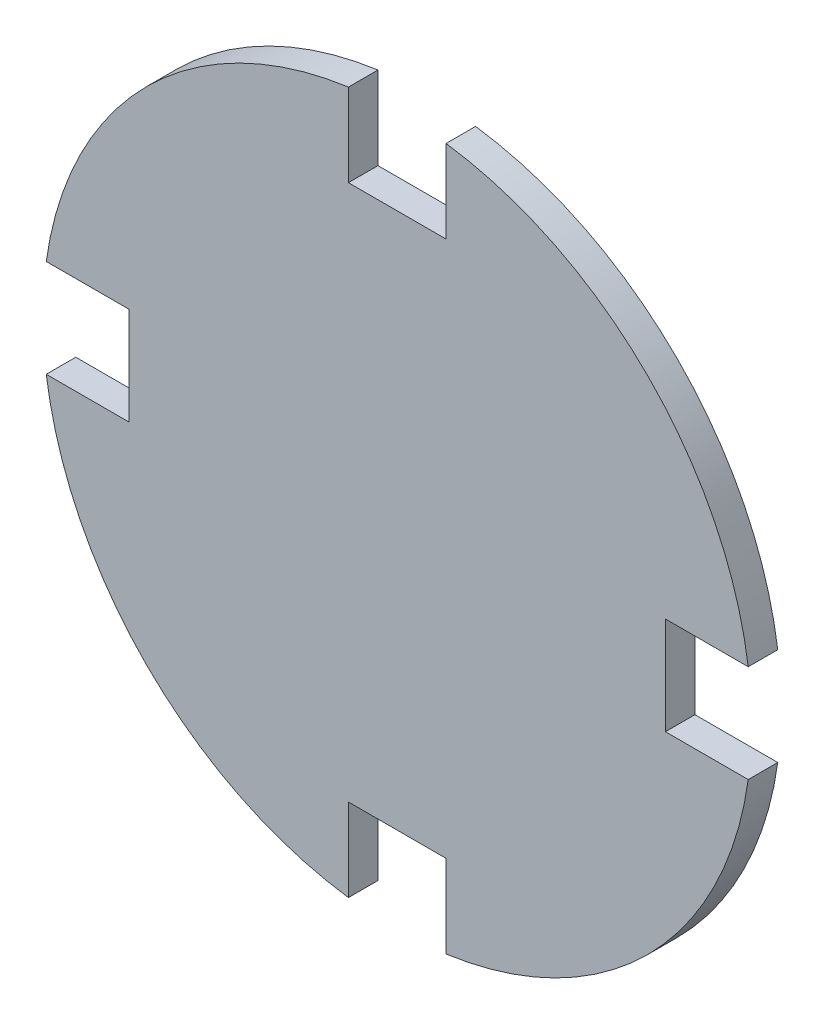
ISO-10303-21;
HEADER;
FILE_DESCRIPTION(('STEP AP214'),'2;1');
FILE_NAME('part.step','',(''),(''),'','','');
FILE_SCHEMA(('AUTOMOTIVE_DESIGN { 1 0 10303 214 1 1 1 1 }'));
ENDSEC;
DATA;
#1=APPLICATION_CONTEXT('core data for automotive mechanical design processes');
#2=APPLICATION_PROTOCOL_DEFINITION('international standard','automotive_design',2000,#1);
#3=PRODUCT_CONTEXT('',#1,'mechanical');
#4=PRODUCT('Part','Part','',(#3));
#5=PRODUCT_RELATED_PRODUCT_CATEGORY('part','',(#4));
#6=PRODUCT_DEFINITION_FORMATION('','',#4);
#7=PRODUCT_DEFINITION_CONTEXT('part definition',#1,'design');
#8=PRODUCT_DEFINITION('design','',#6,#7);
#9=PRODUCT_DEFINITION_SHAPE('','',#8);
#10=(LENGTH_UNIT() NAMED_UNIT(*) SI_UNIT(.MILLI.,.METRE.));
#11=(NAMED_UNIT(*) PLANE_ANGLE_UNIT() SI_UNIT($,.RADIAN.));
#12=(NAMED_UNIT(*) SI_UNIT($,.STERADIAN.) SOLID_ANGLE_UNIT());
#13=UNCERTAINTY_MEASURE_WITH_UNIT(LENGTH_MEASURE(1.E-05),#10,'distance_accuracy_value','');
#14=(GEOMETRIC_REPRESENTATION_CONTEXT(3) GLOBAL_UNCERTAINTY_ASSIGNED_CONTEXT((#13)) GLOBAL_UNIT_ASSIGNED_CONTEXT((#10,
#11,#12)) REPRESENTATION_CONTEXT('',''));
#15=CARTESIAN_POINT('',(0.,0.,0.));
#16=DIRECTION('',(0.,0.,1.));
#17=DIRECTION('',(1.,0.,0.));
#18=AXIS2_PLACEMENT_3D('',#15,#16,#17);
#19=CARTESIAN_POINT('',(-150.946215586881,-20.9999999999746,6.35));
#20=DIRECTION('',(1.69175186859434E-12,1.,0.));
#21=DIRECTION('',(-1.,1.69175186859434E-12,0.));
#22=AXIS2_PLACEMENT_3D('',#19,#20,#21);
#23=PLANE('',#22);
#24=DIRECTION('',(1.,-1.69175186859434E-12,0.));
#25=VECTOR('',#24,1.);
#26=CARTESIAN_POINT('',(-150.946215586881,-20.9999999999746,-6.35));
#27=LINE('',#26,#25);
#28=CARTESIAN_POINT('',(-150.946215586881,-20.9999999999745,-6.35));
#29=VERTEX_POINT('',#28);
#30=CARTESIAN_POINT('',(-115.332,-21.0000000000348,-6.35));
#31=VERTEX_POINT('',#30);
#32=EDGE_CURVE('E182',#29,#31,#27,.T.);
#33=ORIENTED_EDGE('',*,*,#32,.F.);
#34=DIRECTION('',(0.,0.,-1.));
#35=VECTOR('',#34,1.);
#36=CARTESIAN_POINT('',(-150.946215586881,-20.9999999999745,6.35));
#37=LINE('',#36,#35);
#38=CARTESIAN_POINT('',(-150.946215586881,-20.9999999999745,6.35));
#39=VERTEX_POINT('',#38);
#40=EDGE_CURVE('E11',#39,#29,#37,.T.);
#41=ORIENTED_EDGE('',*,*,#40,.F.);
#42=DIRECTION('',(1.,-1.69175186859434E-12,0.));
#43=VECTOR('',#42,1.);
#44=CARTESIAN_POINT('',(-150.946215586881,-20.9999999999746,6.35));
#45=LINE('',#44,#43);
#46=CARTESIAN_POINT('',(-115.332,-21.0000000000348,6.35));
#47=VERTEX_POINT('',#46);
#48=EDGE_CURVE('E217',#39,#47,#45,.T.);
#49=ORIENTED_EDGE('',*,*,#48,.T.);
#50=DIRECTION('',(0.,0.,-1.));
#51=VECTOR('',#50,1.);
#52=CARTESIAN_POINT('',(-115.332,-21.0000000000348,6.35));
#53=LINE('',#52,#51);
#54=EDGE_CURVE('E39',#47,#31,#53,.T.);
#55=ORIENTED_EDGE('',*,*,#54,.T.);
#56=EDGE_LOOP('',(#33,#41,#49,#55));
#57=FACE_BOUND('',#56,.T.);
#58=ADVANCED_FACE('F36',(#57),#23,.T.);
#59=CARTESIAN_POINT('',(0.,0.,6.35));
#60=DIRECTION('',(0.,0.,-1.));
#61=DIRECTION('',(-1.,0.,0.));
#62=AXIS2_PLACEMENT_3D('',#59,#60,#61);
#63=CYLINDRICAL_SURFACE('',#62,152.4);
#64=CARTESIAN_POINT('',(0.,0.,-6.35));
#65=DIRECTION('',(0.,0.,1.));
#66=DIRECTION('',(1.,0.,0.));
#67=AXIS2_PLACEMENT_3D('',#64,#65,#66);
#68=CIRCLE('',#67,152.4);
#69=CARTESIAN_POINT('',(-21.0000000000006,-150.946215586877,-6.35));
#70=VERTEX_POINT('',#69);
#71=EDGE_CURVE('E105',#29,#70,#68,.T.);
#72=ORIENTED_EDGE('',*,*,#71,.T.);
#73=DIRECTION('',(0.,0.,-1.));
#74=VECTOR('',#73,1.);
#75=CARTESIAN_POINT('',(-21.0000000000006,-150.946215586877,6.35));
#76=LINE('',#75,#74);
#77=CARTESIAN_POINT('',(-21.0000000000006,-150.946215586877,6.35));
#78=VERTEX_POINT('',#77);
#79=EDGE_CURVE('E45',#78,#70,#76,.T.);
#80=ORIENTED_EDGE('',*,*,#79,.F.);
#81=CARTESIAN_POINT('',(0.,0.,6.35));
#82=DIRECTION('',(0.,0.,1.));
#83=DIRECTION('',(1.,0.,0.));
#84=AXIS2_PLACEMENT_3D('',#81,#82,#83);
#85=CIRCLE('',#84,152.4);
#86=EDGE_CURVE('E160',#39,#78,#85,.T.);
#87=ORIENTED_EDGE('',*,*,#86,.F.);
#88=ORIENTED_EDGE('',*,*,#40,.T.);
#89=EDGE_LOOP('',(#72,#80,#87,#88));
#90=FACE_BOUND('',#89,.T.);
#91=ADVANCED_FACE('F334',(#90),#63,.T.);
#92=CARTESIAN_POINT('',(-21.0000000000006,-150.946215586877,6.35));
#93=DIRECTION('',(-1.,0.,0.));
#94=DIRECTION('',(0.,0.,1.));
#95=AXIS2_PLACEMENT_3D('',#92,#93,#94);
#96=PLANE('',#95);
#97=DIRECTION('',(0.,1.,0.));
#98=VECTOR('',#97,1.);
#99=CARTESIAN_POINT('',(-21.0000000000006,-150.946215586877,-6.35));
#100=LINE('',#99,#98);
#101=CARTESIAN_POINT('',(-21.0000000000006,-115.332,-6.35));
#102=VERTEX_POINT('',#101);
#103=EDGE_CURVE('E167',#70,#102,#100,.T.);
#104=ORIENTED_EDGE('',*,*,#103,.T.);
#105=DIRECTION('',(0.,0.,-1.));
#106=VECTOR('',#105,1.);
#107=CARTESIAN_POINT('',(-21.0000000000006,-115.332,6.35));
#108=LINE('',#107,#106);
#109=CARTESIAN_POINT('',(-21.0000000000006,-115.332,6.35));
#110=VERTEX_POINT('',#109);
#111=EDGE_CURVE('E164',#110,#102,#108,.T.);
#112=ORIENTED_EDGE('',*,*,#111,.F.);
#113=DIRECTION('',(0.,1.,0.));
#114=VECTOR('',#113,1.);
#115=CARTESIAN_POINT('',(-21.0000000000006,-150.946215586877,6.35));
#116=LINE('',#115,#114);
#117=EDGE_CURVE('E153',#78,#110,#116,.T.);
#118=ORIENTED_EDGE('',*,*,#117,.F.);
#119=ORIENTED_EDGE('',*,*,#79,.T.);
#120=EDGE_LOOP('',(#104,#112,#118,#119));
#121=FACE_BOUND('',#120,.T.);
#122=ADVANCED_FACE('F165',(#121),#96,.F.);
#123=CARTESIAN_POINT('',(-21.0000000000006,-115.332,6.35));
#124=DIRECTION('',(0.,1.,0.));
#125=DIRECTION('',(0.,0.,1.));
#126=AXIS2_PLACEMENT_3D('',#123,#124,#125);
#127=PLANE('',#126);
#128=DIRECTION('',(1.,0.,0.));
#129=VECTOR('',#128,1.);
#130=CARTESIAN_POINT('',(-21.0000000000006,-115.332,-6.35));
#131=LINE('',#130,#129);
#132=CARTESIAN_POINT('',(20.9999999999994,-115.332,-6.35));
#133=VERTEX_POINT('',#132);
#134=EDGE_CURVE('E214',#102,#133,#131,.T.);
#135=ORIENTED_EDGE('',*,*,#134,.T.);
#136=DIRECTION('',(0.,0.,-1.));
#137=VECTOR('',#136,1.);
#138=CARTESIAN_POINT('',(20.9999999999994,-115.332,6.35));
#139=LINE('',#138,#137);
#140=CARTESIAN_POINT('',(20.9999999999994,-115.332,6.35));
#141=VERTEX_POINT('',#140);
#142=EDGE_CURVE('E171',#141,#133,#139,.T.);
#143=ORIENTED_EDGE('',*,*,#142,.F.);
#144=DIRECTION('',(1.,0.,0.));
#145=VECTOR('',#144,1.);
#146=CARTESIAN_POINT('',(-21.0000000000006,-115.332,6.35));
#147=LINE('',#146,#145);
#148=EDGE_CURVE('E158',#110,#141,#147,.T.);
#149=ORIENTED_EDGE('',*,*,#148,.F.);
#150=ORIENTED_EDGE('',*,*,#111,.T.);
#151=EDGE_LOOP('',(#135,#143,#149,#150));
#152=FACE_BOUND('',#151,.T.);
#153=ADVANCED_FACE('F173',(#152),#127,.F.);
#154=CARTESIAN_POINT('',(20.9999999999994,-150.946215586877,6.35));
#155=DIRECTION('',(-1.,0.,0.));
#156=DIRECTION('',(0.,0.,1.));
#157=AXIS2_PLACEMENT_3D('',#154,#155,#156);
#158=PLANE('',#157);
#159=DIRECTION('',(0.,1.,0.));
#160=VECTOR('',#159,1.);
#161=CARTESIAN_POINT('',(20.9999999999994,-150.946215586877,-6.35));
#162=LINE('',#161,#160);
#163=CARTESIAN_POINT('',(20.9999999999994,-150.946215586877,-6.35));
#164=VERTEX_POINT('',#163);
#165=EDGE_CURVE('E211',#164,#133,#162,.T.);
#166=ORIENTED_EDGE('',*,*,#165,.F.);
#167=DIRECTION('',(0.,0.,-1.));
#168=VECTOR('',#167,1.);
#169=CARTESIAN_POINT('',(20.9999999999994,-150.946215586877,6.35));
#170=LINE('',#169,#168);
#171=CARTESIAN_POINT('',(20.9999999999994,-150.946215586877,6.35));
#172=VERTEX_POINT('',#171);
#173=EDGE_CURVE('E221',#172,#164,#170,.T.);
#174=ORIENTED_EDGE('',*,*,#173,.F.);
#175=DIRECTION('',(0.,1.,0.));
#176=VECTOR('',#175,1.);
#177=CARTESIAN_POINT('',(20.9999999999994,-150.946215586877,6.35));
#178=LINE('',#177,#176);
#179=EDGE_CURVE('E175',#172,#141,#178,.T.);
#180=ORIENTED_EDGE('',*,*,#179,.T.);
#181=ORIENTED_EDGE('',*,*,#142,.T.);
#182=EDGE_LOOP('',(#166,#174,#180,#181));
#183=FACE_BOUND('',#182,.T.);
#184=ADVANCED_FACE('F259',(#183),#158,.T.);
#185=CARTESIAN_POINT('',(0.,0.,6.35));
#186=DIRECTION('',(0.,0.,-1.));
#187=DIRECTION('',(-1.,0.,0.));
#188=AXIS2_PLACEMENT_3D('',#185,#186,#187);
#189=CYLINDRICAL_SURFACE('',#188,152.4);
#190=CARTESIAN_POINT('',(0.,0.,-6.35));
#191=DIRECTION('',(0.,0.,1.));
#192=DIRECTION('',(1.,0.,0.));
#193=AXIS2_PLACEMENT_3D('',#190,#191,#192);
#194=CIRCLE('',#193,152.4);
#195=CARTESIAN_POINT('',(150.946215586881,-20.9999999999746,-6.35));
#196=VERTEX_POINT('',#195);
#197=EDGE_CURVE('E209',#164,#196,#194,.T.);
#198=ORIENTED_EDGE('',*,*,#197,.T.);
#199=DIRECTION('',(0.,0.,-1.));
#200=VECTOR('',#199,1.);
#201=CARTESIAN_POINT('',(150.946215586881,-20.9999999999746,6.35));
#202=LINE('',#201,#200);
#203=CARTESIAN_POINT('',(150.946215586881,-20.9999999999746,6.35));
#204=VERTEX_POINT('',#203);
#205=EDGE_CURVE('E223',#204,#196,#202,.T.);
#206=ORIENTED_EDGE('',*,*,#205,.F.);
#207=CARTESIAN_POINT('',(0.,0.,6.35));
#208=DIRECTION('',(0.,0.,1.));
#209=DIRECTION('',(1.,0.,0.));
#210=AXIS2_PLACEMENT_3D('',#207,#208,#209);
#211=CIRCLE('',#210,152.4);
#212=EDGE_CURVE('E177',#172,#204,#211,.T.);
#213=ORIENTED_EDGE('',*,*,#212,.F.);
#214=ORIENTED_EDGE('',*,*,#173,.T.);
#215=EDGE_LOOP('',(#198,#206,#213,#214));
#216=FACE_BOUND('',#215,.T.);
#217=ADVANCED_FACE('F266',(#216),#189,.T.);
#218=CARTESIAN_POINT('',(150.946215586881,-20.9999999999746,6.35));
#219=DIRECTION('',(0.,-1.,0.));
#220=DIRECTION('',(1.,0.,0.));
#221=AXIS2_PLACEMENT_3D('',#218,#219,#220);
#222=PLANE('',#221);
#223=DIRECTION('',(-1.,0.,0.));
#224=VECTOR('',#223,1.);
#225=CARTESIAN_POINT('',(150.946215586881,-20.9999999999746,-6.35));
#226=LINE('',#225,#224);
#227=CARTESIAN_POINT('',(115.332,-20.9999999999745,-6.35));
#228=VERTEX_POINT('',#227);
#229=EDGE_CURVE('E207',#196,#228,#226,.T.);
#230=ORIENTED_EDGE('',*,*,#229,.T.);
#231=DIRECTION('',(0.,0.,-1.));
#232=VECTOR('',#231,1.);
#233=CARTESIAN_POINT('',(115.332,-20.9999999999745,6.35));
#234=LINE('',#233,#232);
#235=CARTESIAN_POINT('',(115.332,-20.9999999999745,6.35));
#236=VERTEX_POINT('',#235);
#237=EDGE_CURVE('E226',#236,#228,#234,.T.);
#238=ORIENTED_EDGE('',*,*,#237,.F.);
#239=DIRECTION('',(-1.,0.,0.));
#240=VECTOR('',#239,1.);
#241=CARTESIAN_POINT('',(150.946215586881,-20.9999999999746,6.35));
#242=LINE('',#241,#240);
#243=EDGE_CURVE('E263',#204,#236,#242,.T.);
#244=ORIENTED_EDGE('',*,*,#243,.F.);
#245=ORIENTED_EDGE('',*,*,#205,.T.);
#246=EDGE_LOOP('',(#230,#238,#244,#245));
#247=FACE_BOUND('',#246,.T.);
#248=ADVANCED_FACE('F268',(#247),#222,.F.);
#249=CARTESIAN_POINT('',(115.332,-20.9999999999745,6.35));
#250=DIRECTION('',(-1.,0.,0.));
#251=DIRECTION('',(0.,-1.,0.));
#252=AXIS2_PLACEMENT_3D('',#249,#250,#251);
#253=PLANE('',#252);
#254=DIRECTION('',(0.,1.,0.));
#255=VECTOR('',#254,1.);
#256=CARTESIAN_POINT('',(115.332,-20.9999999999745,-6.35));
#257=LINE('',#256,#255);
#258=CARTESIAN_POINT('',(115.332,21.0000000000255,-6.35));
#259=VERTEX_POINT('',#258);
#260=EDGE_CURVE('E205',#228,#259,#257,.T.);
#261=ORIENTED_EDGE('',*,*,#260,.T.);
#262=DIRECTION('',(0.,0.,-1.));
#263=VECTOR('',#262,1.);
#264=CARTESIAN_POINT('',(115.332,21.0000000000255,6.35));
#265=LINE('',#264,#263);
#266=CARTESIAN_POINT('',(115.332,21.0000000000255,6.35));
#267=VERTEX_POINT('',#266);
#268=EDGE_CURVE('E229',#267,#259,#265,.T.);
#269=ORIENTED_EDGE('',*,*,#268,.F.);
#270=DIRECTION('',(0.,1.,0.));
#271=VECTOR('',#270,1.);
#272=CARTESIAN_POINT('',(115.332,-20.9999999999745,6.35));
#273=LINE('',#272,#271);
#274=EDGE_CURVE('E270',#236,#267,#273,.T.);
#275=ORIENTED_EDGE('',*,*,#274,.F.);
#276=ORIENTED_EDGE('',*,*,#237,.T.);
#277=EDGE_LOOP('',(#261,#269,#275,#276));
#278=FACE_BOUND('',#277,.T.);
#279=ADVANCED_FACE('F324',(#278),#253,.F.);
#280=CARTESIAN_POINT('',(115.332,21.0000000000255,6.35));
#281=DIRECTION('',(0.,1.,0.));
#282=DIRECTION('',(0.,0.,1.));
#283=AXIS2_PLACEMENT_3D('',#280,#281,#282);
#284=PLANE('',#283);
#285=DIRECTION('',(1.,0.,0.));
#286=VECTOR('',#285,1.);
#287=CARTESIAN_POINT('',(115.332,21.0000000000255,-6.35));
#288=LINE('',#287,#286);
#289=CARTESIAN_POINT('',(150.946215586874,21.0000000000255,-6.35));
#290=VERTEX_POINT('',#289);
#291=EDGE_CURVE('E203',#259,#290,#288,.T.);
#292=ORIENTED_EDGE('',*,*,#291,.T.);
#293=DIRECTION('',(0.,0.,-1.));
#294=VECTOR('',#293,1.);
#295=CARTESIAN_POINT('',(150.946215586874,21.0000000000255,6.35));
#296=LINE('',#295,#294);
#297=CARTESIAN_POINT('',(150.946215586874,21.0000000000255,6.35));
#298=VERTEX_POINT('',#297);
#299=EDGE_CURVE('E232',#298,#290,#296,.T.);
#300=ORIENTED_EDGE('',*,*,#299,.F.);
#301=DIRECTION('',(1.,0.,0.));
#302=VECTOR('',#301,1.);
#303=CARTESIAN_POINT('',(115.332,21.0000000000255,6.35));
#304=LINE('',#303,#302);
#305=EDGE_CURVE('E272',#267,#298,#304,.T.);
#306=ORIENTED_EDGE('',*,*,#305,.F.);
#307=ORIENTED_EDGE('',*,*,#268,.T.);
#308=EDGE_LOOP('',(#292,#300,#306,#307));
#309=FACE_BOUND('',#308,.T.);
#310=ADVANCED_FACE('F320',(#309),#284,.F.);
#311=CARTESIAN_POINT('',(0.,0.,6.35));
#312=DIRECTION('',(0.,0.,-1.));
#313=DIRECTION('',(-1.,0.,0.));
#314=AXIS2_PLACEMENT_3D('',#311,#312,#313);
#315=CYLINDRICAL_SURFACE('',#314,152.4);
#316=CARTESIAN_POINT('',(0.,0.,-6.35));
#317=DIRECTION('',(0.,0.,1.));
#318=DIRECTION('',(1.,0.,0.));
#319=AXIS2_PLACEMENT_3D('',#316,#317,#318);
#320=CIRCLE('',#319,152.4);
#321=CARTESIAN_POINT('',(20.9999999999994,150.946215586877,-6.35));
#322=VERTEX_POINT('',#321);
#323=EDGE_CURVE('E201',#290,#322,#320,.T.);
#324=ORIENTED_EDGE('',*,*,#323,.T.);
#325=DIRECTION('',(0.,0.,-1.));
#326=VECTOR('',#325,1.);
#327=CARTESIAN_POINT('',(20.9999999999994,150.946215586877,6.35));
#328=LINE('',#327,#326);
#329=CARTESIAN_POINT('',(20.9999999999994,150.946215586877,6.35));
#330=VERTEX_POINT('',#329);
#331=EDGE_CURVE('E235',#330,#322,#328,.T.);
#332=ORIENTED_EDGE('',*,*,#331,.F.);
#333=CARTESIAN_POINT('',(0.,0.,6.35));
#334=DIRECTION('',(0.,0.,1.));
#335=DIRECTION('',(1.,0.,0.));
#336=AXIS2_PLACEMENT_3D('',#333,#334,#335);
#337=CIRCLE('',#336,152.4);
#338=EDGE_CURVE('E276',#298,#330,#337,.T.);
#339=ORIENTED_EDGE('',*,*,#338,.F.);
#340=ORIENTED_EDGE('',*,*,#299,.T.);
#341=EDGE_LOOP('',(#324,#332,#339,#340));
#342=FACE_BOUND('',#341,.T.);
#343=ADVANCED_FACE('F316',(#342),#315,.T.);
#344=CARTESIAN_POINT('',(20.9999999999994,150.946215586877,6.35));
#345=DIRECTION('',(1.,0.,0.));
#346=DIRECTION('',(0.,1.,0.));
#347=AXIS2_PLACEMENT_3D('',#344,#345,#346);
#348=PLANE('',#347);
#349=DIRECTION('',(0.,-1.,0.));
#350=VECTOR('',#349,1.);
#351=CARTESIAN_POINT('',(20.9999999999994,150.946215586877,-6.35));
#352=LINE('',#351,#350);
#353=CARTESIAN_POINT('',(20.9999999999994,115.332,-6.35));
#354=VERTEX_POINT('',#353);
#355=EDGE_CURVE('E198',#322,#354,#352,.T.);
#356=ORIENTED_EDGE('',*,*,#355,.T.);
#357=DIRECTION('',(0.,0.,-1.));
#358=VECTOR('',#357,1.);
#359=CARTESIAN_POINT('',(20.9999999999994,115.332,6.35));
#360=LINE('',#359,#358);
#361=CARTESIAN_POINT('',(20.9999999999994,115.332,6.35));
#362=VERTEX_POINT('',#361);
#363=EDGE_CURVE('E238',#362,#354,#360,.T.);
#364=ORIENTED_EDGE('',*,*,#363,.F.);
#365=DIRECTION('',(0.,-1.,0.));
#366=VECTOR('',#365,1.);
#367=CARTESIAN_POINT('',(20.9999999999994,150.946215586877,6.35));
#368=LINE('',#367,#366);
#369=EDGE_CURVE('E278',#330,#362,#368,.T.);
#370=ORIENTED_EDGE('',*,*,#369,.F.);
#371=ORIENTED_EDGE('',*,*,#331,.T.);
#372=EDGE_LOOP('',(#356,#364,#370,#371));
#373=FACE_BOUND('',#372,.T.);
#374=ADVANCED_FACE('F311',(#373),#348,.F.);
#375=CARTESIAN_POINT('',(-21.0000000000006,115.332,6.35));
#376=DIRECTION('',(0.,1.,0.));
#377=DIRECTION('',(0.,0.,1.));
#378=AXIS2_PLACEMENT_3D('',#375,#376,#377);
#379=PLANE('',#378);
#380=DIRECTION('',(1.,0.,0.));
#381=VECTOR('',#380,1.);
#382=CARTESIAN_POINT('',(-21.0000000000006,115.332,-6.35));
#383=LINE('',#382,#381);
#384=CARTESIAN_POINT('',(-21.0000000000006,115.332,-6.35));
#385=VERTEX_POINT('',#384);
#386=EDGE_CURVE('E195',#385,#354,#383,.T.);
#387=ORIENTED_EDGE('',*,*,#386,.F.);
#388=DIRECTION('',(0.,0.,-1.));
#389=VECTOR('',#388,1.);
#390=CARTESIAN_POINT('',(-21.0000000000006,115.332,6.35));
#391=LINE('',#390,#389);
#392=CARTESIAN_POINT('',(-21.0000000000006,115.332,6.35));
#393=VERTEX_POINT('',#392);
#394=EDGE_CURVE('E240',#393,#385,#391,.T.);
#395=ORIENTED_EDGE('',*,*,#394,.F.);
#396=DIRECTION('',(1.,0.,0.));
#397=VECTOR('',#396,1.);
#398=CARTESIAN_POINT('',(-21.0000000000006,115.332,6.35));
#399=LINE('',#398,#397);
#400=EDGE_CURVE('E280',#393,#362,#399,.T.);
#401=ORIENTED_EDGE('',*,*,#400,.T.);
#402=ORIENTED_EDGE('',*,*,#363,.T.);
#403=EDGE_LOOP('',(#387,#395,#401,#402));
#404=FACE_BOUND('',#403,.T.);
#405=ADVANCED_FACE('F305',(#404),#379,.T.);
#406=CARTESIAN_POINT('',(-21.0000000000006,150.946215586877,6.35));
#407=DIRECTION('',(1.,0.,0.));
#408=DIRECTION('',(0.,1.,0.));
#409=AXIS2_PLACEMENT_3D('',#406,#407,#408);
#410=PLANE('',#409);
#411=DIRECTION('',(0.,-1.,0.));
#412=VECTOR('',#411,1.);
#413=CARTESIAN_POINT('',(-21.0000000000006,150.946215586877,-6.35));
#414=LINE('',#413,#412);
#415=CARTESIAN_POINT('',(-21.0000000000006,150.946215586877,-6.35));
#416=VERTEX_POINT('',#415);
#417=EDGE_CURVE('E192',#416,#385,#414,.T.);
#418=ORIENTED_EDGE('',*,*,#417,.F.);
#419=DIRECTION('',(0.,0.,-1.));
#420=VECTOR('',#419,1.);
#421=CARTESIAN_POINT('',(-21.0000000000006,150.946215586877,6.35));
#422=LINE('',#421,#420);
#423=CARTESIAN_POINT('',(-21.0000000000006,150.946215586877,6.35));
#424=VERTEX_POINT('',#423);
#425=EDGE_CURVE('E242',#424,#416,#422,.T.);
#426=ORIENTED_EDGE('',*,*,#425,.F.);
#427=DIRECTION('',(0.,-1.,0.));
#428=VECTOR('',#427,1.);
#429=CARTESIAN_POINT('',(-21.0000000000006,150.946215586877,6.35));
#430=LINE('',#429,#428);
#431=EDGE_CURVE('E283',#424,#393,#430,.T.);
#432=ORIENTED_EDGE('',*,*,#431,.T.);
#433=ORIENTED_EDGE('',*,*,#394,.T.);
#434=EDGE_LOOP('',(#418,#426,#432,#433));
#435=FACE_BOUND('',#434,.T.);
#436=ADVANCED_FACE('F301',(#435),#410,.T.);
#437=CARTESIAN_POINT('',(0.,0.,6.35));
#438=DIRECTION('',(0.,0.,-1.));
#439=DIRECTION('',(-1.,0.,0.));
#440=AXIS2_PLACEMENT_3D('',#437,#438,#439);
#441=CYLINDRICAL_SURFACE('',#440,152.4);
#442=CARTESIAN_POINT('',(0.,0.,-6.35));
#443=DIRECTION('',(0.,0.,1.));
#444=DIRECTION('',(1.,0.,0.));
#445=AXIS2_PLACEMENT_3D('',#442,#443,#444);
#446=CIRCLE('',#445,152.4);
#447=CARTESIAN_POINT('',(-150.946215586877,20.9999999999996,-6.35));
#448=VERTEX_POINT('',#447);
#449=EDGE_CURVE('E190',#416,#448,#446,.T.);
#450=ORIENTED_EDGE('',*,*,#449,.T.);
#451=DIRECTION('',(0.,0.,-1.));
#452=VECTOR('',#451,1.);
#453=CARTESIAN_POINT('',(-150.946215586877,20.9999999999996,6.35));
#454=LINE('',#453,#452);
#455=CARTESIAN_POINT('',(-150.946215586877,20.9999999999996,6.35));
#456=VERTEX_POINT('',#455);
#457=EDGE_CURVE('E244',#456,#448,#454,.T.);
#458=ORIENTED_EDGE('',*,*,#457,.F.);
#459=CARTESIAN_POINT('',(0.,0.,6.35));
#460=DIRECTION('',(0.,0.,1.));
#461=DIRECTION('',(1.,0.,0.));
#462=AXIS2_PLACEMENT_3D('',#459,#460,#461);
#463=CIRCLE('',#462,152.4);
#464=EDGE_CURVE('E286',#424,#456,#463,.T.);
#465=ORIENTED_EDGE('',*,*,#464,.F.);
#466=ORIENTED_EDGE('',*,*,#425,.T.);
#467=EDGE_LOOP('',(#450,#458,#465,#466));
#468=FACE_BOUND('',#467,.T.);
#469=ADVANCED_FACE('F402',(#468),#441,.T.);
#470=CARTESIAN_POINT('',(-150.946215586877,20.9999999999996,6.35));
#471=DIRECTION('',(0.,1.,0.));
#472=DIRECTION('',(0.,0.,1.));
#473=AXIS2_PLACEMENT_3D('',#470,#471,#472);
#474=PLANE('',#473);
#475=DIRECTION('',(1.,0.,0.));
#476=VECTOR('',#475,1.);
#477=CARTESIAN_POINT('',(-150.946215586877,20.9999999999996,-6.35));
#478=LINE('',#477,#476);
#479=CARTESIAN_POINT('',(-115.332,20.9999999999996,-6.35));
#480=VERTEX_POINT('',#479);
#481=EDGE_CURVE('E188',#448,#480,#478,.T.);
#482=ORIENTED_EDGE('',*,*,#481,.T.);
#483=DIRECTION('',(0.,0.,-1.));
#484=VECTOR('',#483,1.);
#485=CARTESIAN_POINT('',(-115.332,20.9999999999996,6.35));
#486=LINE('',#485,#484);
#487=CARTESIAN_POINT('',(-115.332,20.9999999999996,6.35));
#488=VERTEX_POINT('',#487);
#489=EDGE_CURVE('E246',#488,#480,#486,.T.);
#490=ORIENTED_EDGE('',*,*,#489,.F.);
#491=DIRECTION('',(1.,0.,0.));
#492=VECTOR('',#491,1.);
#493=CARTESIAN_POINT('',(-150.946215586877,20.9999999999996,6.35));
#494=LINE('',#493,#492);
#495=EDGE_CURVE('E288',#456,#488,#494,.T.);
#496=ORIENTED_EDGE('',*,*,#495,.F.);
#497=ORIENTED_EDGE('',*,*,#457,.T.);
#498=EDGE_LOOP('',(#482,#490,#496,#497));
#499=FACE_BOUND('',#498,.T.);
#500=ADVANCED_FACE('F296',(#499),#474,.F.);
#501=CARTESIAN_POINT('',(-115.332,20.9999999999996,6.35));
#502=DIRECTION('',(1.,0.,0.));
#503=DIRECTION('',(0.,1.,0.));
#504=AXIS2_PLACEMENT_3D('',#501,#502,#503);
#505=PLANE('',#504);
#506=DIRECTION('',(0.,-1.,0.));
#507=VECTOR('',#506,1.);
#508=CARTESIAN_POINT('',(-115.332,20.9999999999996,-6.35));
#509=LINE('',#508,#507);
#510=EDGE_CURVE('E185',#480,#31,#509,.T.);
#511=ORIENTED_EDGE('',*,*,#510,.T.);
#512=ORIENTED_EDGE('',*,*,#54,.F.);
#513=DIRECTION('',(0.,-1.,0.));
#514=VECTOR('',#513,1.);
#515=CARTESIAN_POINT('',(-115.332,20.9999999999996,6.35));
#516=LINE('',#515,#514);
#517=EDGE_CURVE('E115',#488,#47,#516,.T.);
#518=ORIENTED_EDGE('',*,*,#517,.F.);
#519=ORIENTED_EDGE('',*,*,#489,.T.);
#520=EDGE_LOOP('',(#511,#512,#518,#519));
#521=FACE_BOUND('',#520,.T.);
#522=ADVANCED_FACE('F251',(#521),#505,.F.);
#523=CARTESIAN_POINT('',(0.,0.,6.35));
#524=DIRECTION('',(0.,0.,1.));
#525=DIRECTION('',(1.,0.,0.));
#526=AXIS2_PLACEMENT_3D('',#523,#524,#525);
#527=PLANE('',#526);
#528=ORIENTED_EDGE('',*,*,#48,.F.);
#529=ORIENTED_EDGE('',*,*,#86,.T.);
#530=ORIENTED_EDGE('',*,*,#117,.T.);
#531=ORIENTED_EDGE('',*,*,#148,.T.);
#532=ORIENTED_EDGE('',*,*,#179,.F.);
#533=ORIENTED_EDGE('',*,*,#212,.T.);
#534=ORIENTED_EDGE('',*,*,#243,.T.);
#535=ORIENTED_EDGE('',*,*,#274,.T.);
#536=ORIENTED_EDGE('',*,*,#305,.T.);
#537=ORIENTED_EDGE('',*,*,#338,.T.);
#538=ORIENTED_EDGE('',*,*,#369,.T.);
#539=ORIENTED_EDGE('',*,*,#400,.F.);
#540=ORIENTED_EDGE('',*,*,#431,.F.);
#541=ORIENTED_EDGE('',*,*,#464,.T.);
#542=ORIENTED_EDGE('',*,*,#495,.T.);
#543=ORIENTED_EDGE('',*,*,#517,.T.);
#544=EDGE_LOOP('',(#528,#529,#530,#531,#532,#533,#534,#535,#536,#537,#538,#539,#540,#541,#542,#543));
#545=FACE_BOUND('',#544,.T.);
#546=ADVANCED_FACE('F155',(#545),#527,.T.);
#547=CARTESIAN_POINT('',(0.,0.,-6.35));
#548=DIRECTION('',(0.,0.,1.));
#549=DIRECTION('',(1.,0.,0.));
#550=AXIS2_PLACEMENT_3D('',#547,#548,#549);
#551=PLANE('',#550);
#552=ORIENTED_EDGE('',*,*,#32,.T.);
#553=ORIENTED_EDGE('',*,*,#510,.F.);
#554=ORIENTED_EDGE('',*,*,#481,.F.);
#555=ORIENTED_EDGE('',*,*,#449,.F.);
#556=ORIENTED_EDGE('',*,*,#417,.T.);
#557=ORIENTED_EDGE('',*,*,#386,.T.);
#558=ORIENTED_EDGE('',*,*,#355,.F.);
#559=ORIENTED_EDGE('',*,*,#323,.F.);
#560=ORIENTED_EDGE('',*,*,#291,.F.);
#561=ORIENTED_EDGE('',*,*,#260,.F.);
#562=ORIENTED_EDGE('',*,*,#229,.F.);
#563=ORIENTED_EDGE('',*,*,#197,.F.);
#564=ORIENTED_EDGE('',*,*,#165,.T.);
#565=ORIENTED_EDGE('',*,*,#134,.F.);
#566=ORIENTED_EDGE('',*,*,#103,.F.);
#567=ORIENTED_EDGE('',*,*,#71,.F.);
#568=EDGE_LOOP('',(#552,#553,#554,#555,#556,#557,#558,#559,#560,#561,#562,#563,#564,#565,#566,#567));
#569=FACE_BOUND('',#568,.T.);
#570=ADVANCED_FACE('F254',(#569),#551,.F.);
#571=CLOSED_SHELL('',(#58,#91,#122,#153,#184,#217,#248,#279,#310,#343,#374,#405,#436,#469,#500,
#522,#546,#570));
#572=MANIFOLD_SOLID_BREP('B2',#571);
#573=ADVANCED_BREP_SHAPE_REPRESENTATION('',(#18,#572),#14);
#574=SHAPE_DEFINITION_REPRESENTATION(#9,#573);
ENDSEC;
END-ISO-10303-21;
